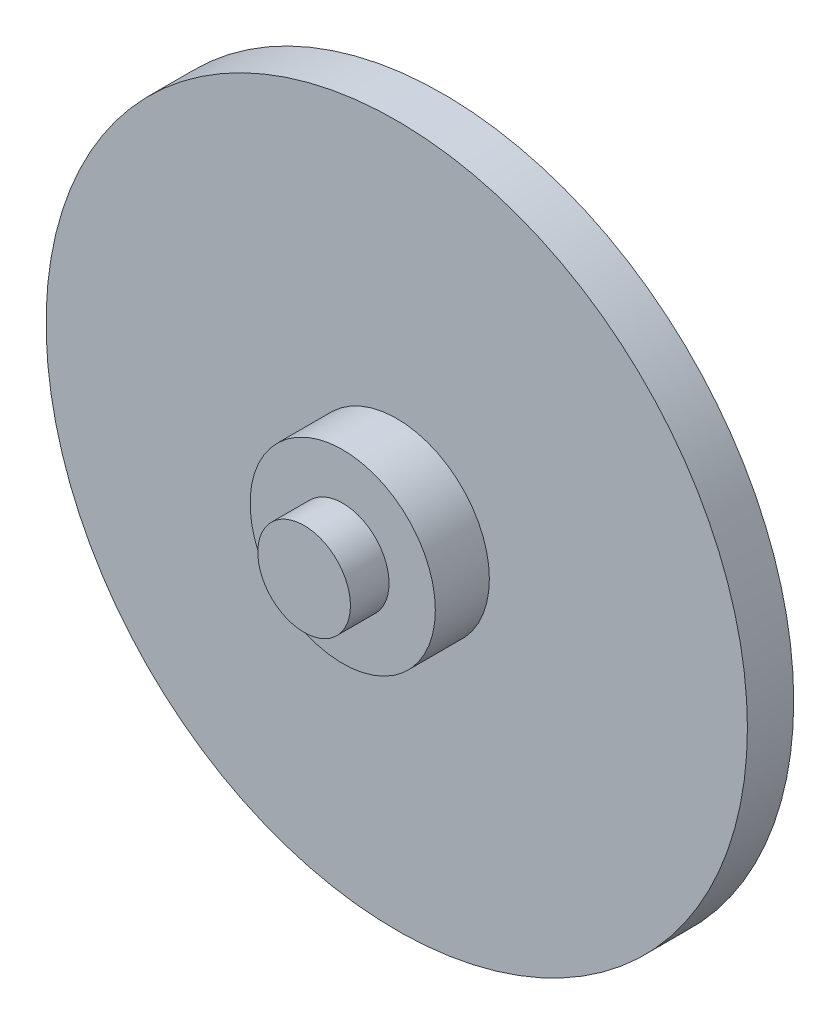
ISO-10303-21;
HEADER;
FILE_DESCRIPTION(('STEP AP214'),'2;1');
FILE_NAME('part.step','',(''),(''),'','','');
FILE_SCHEMA(('AUTOMOTIVE_DESIGN { 1 0 10303 214 1 1 1 1 }'));
ENDSEC;
DATA;
#1=APPLICATION_CONTEXT('core data for automotive mechanical design processes');
#2=APPLICATION_PROTOCOL_DEFINITION('international standard','automotive_design',2000,#1);
#3=PRODUCT_CONTEXT('',#1,'mechanical');
#4=PRODUCT('Part','Part','',(#3));
#5=PRODUCT_RELATED_PRODUCT_CATEGORY('part','',(#4));
#6=PRODUCT_DEFINITION_FORMATION('','',#4);
#7=PRODUCT_DEFINITION_CONTEXT('part definition',#1,'design');
#8=PRODUCT_DEFINITION('design','',#6,#7);
#9=PRODUCT_DEFINITION_SHAPE('','',#8);
#10=(LENGTH_UNIT() NAMED_UNIT(*) SI_UNIT(.MILLI.,.METRE.));
#11=(NAMED_UNIT(*) PLANE_ANGLE_UNIT() SI_UNIT($,.RADIAN.));
#12=(NAMED_UNIT(*) SI_UNIT($,.STERADIAN.) SOLID_ANGLE_UNIT());
#13=UNCERTAINTY_MEASURE_WITH_UNIT(LENGTH_MEASURE(1.E-05),#10,'distance_accuracy_value','');
#14=(GEOMETRIC_REPRESENTATION_CONTEXT(3) GLOBAL_UNCERTAINTY_ASSIGNED_CONTEXT((#13)) GLOBAL_UNIT_ASSIGNED_CONTEXT((#10,
#11,#12)) REPRESENTATION_CONTEXT('',''));
#15=CARTESIAN_POINT('',(0.,0.,0.));
#16=DIRECTION('',(0.,0.,1.));
#17=DIRECTION('',(1.,0.,0.));
#18=AXIS2_PLACEMENT_3D('',#15,#16,#17);
#19=CARTESIAN_POINT('',(-5.26595400064789,0.,3.98021116044797));
#20=DIRECTION('',(0.,0.,-1.));
#21=DIRECTION('',(-1.,0.,0.));
#22=AXIS2_PLACEMENT_3D('',#19,#20,#21);
#23=CYLINDRICAL_SURFACE('',#22,6.8145);
#24=CARTESIAN_POINT('',(-5.26595400064789,0.,3.98021116044797));
#25=DIRECTION('',(0.,0.,1.));
#26=DIRECTION('',(1.,0.,0.));
#27=AXIS2_PLACEMENT_3D('',#24,#25,#26);
#28=CIRCLE('',#27,6.8145);
#29=CARTESIAN_POINT('',(1.54854599935211,0.,3.98021116044797));
#30=VERTEX_POINT('',#29);
#31=EDGE_CURVE('E47',#30,#30,#28,.T.);
#32=ORIENTED_EDGE('',*,*,#31,.F.);
#33=EDGE_LOOP('',(#32));
#34=FACE_BOUND('',#33,.T.);
#35=CARTESIAN_POINT('',(-5.26595400064789,0.,3.08021116044797));
#36=DIRECTION('',(0.,0.,1.));
#37=DIRECTION('',(1.,0.,0.));
#38=AXIS2_PLACEMENT_3D('',#35,#36,#37);
#39=CIRCLE('',#38,6.8145);
#40=CARTESIAN_POINT('',(1.54854599935211,0.,3.08021116044797));
#41=VERTEX_POINT('',#40);
#42=EDGE_CURVE('E38',#41,#41,#39,.T.);
#43=ORIENTED_EDGE('',*,*,#42,.T.);
#44=EDGE_LOOP('',(#43));
#45=FACE_BOUND('',#44,.T.);
#46=ADVANCED_FACE('F35',(#34,#45),#23,.T.);
#47=CARTESIAN_POINT('',(-5.26595400064789,0.,3.98021116044797));
#48=DIRECTION('',(0.,0.,1.));
#49=DIRECTION('',(1.,0.,0.));
#50=AXIS2_PLACEMENT_3D('',#47,#48,#49);
#51=PLANE('',#50);
#52=CARTESIAN_POINT('',(-5.26595400064789,0.,3.98021116044797));
#53=DIRECTION('',(0.,0.,1.));
#54=DIRECTION('',(1.,0.,0.));
#55=AXIS2_PLACEMENT_3D('',#52,#53,#54);
#56=CIRCLE('',#55,1.8);
#57=CARTESIAN_POINT('',(-3.46595400064789,0.,3.98021116044797));
#58=VERTEX_POINT('',#57);
#59=EDGE_CURVE('E42',#58,#58,#56,.T.);
#60=ORIENTED_EDGE('',*,*,#59,.F.);
#61=EDGE_LOOP('',(#60));
#62=FACE_BOUND('',#61,.T.);
#63=ORIENTED_EDGE('',*,*,#31,.T.);
#64=EDGE_LOOP('',(#63));
#65=FACE_BOUND('',#64,.T.);
#66=ADVANCED_FACE('F65',(#62,#65),#51,.T.);
#67=CARTESIAN_POINT('',(-5.26595400064789,0.,3.08021116044797));
#68=DIRECTION('',(0.,0.,1.));
#69=DIRECTION('',(1.,0.,0.));
#70=AXIS2_PLACEMENT_3D('',#67,#68,#69);
#71=PLANE('',#70);
#72=CARTESIAN_POINT('',(-5.26595400064789,0.,3.08021116044797));
#73=DIRECTION('',(0.,0.,-1.));
#74=DIRECTION('',(-1.,0.,0.));
#75=AXIS2_PLACEMENT_3D('',#72,#73,#74);
#76=CIRCLE('',#75,0.45);
#77=CARTESIAN_POINT('',(-5.71595400064789,0.,3.08021116044797));
#78=VERTEX_POINT('',#77);
#79=EDGE_CURVE('E151',#78,#78,#76,.T.);
#80=ORIENTED_EDGE('',*,*,#79,.F.);
#81=EDGE_LOOP('',(#80));
#82=FACE_BOUND('',#81,.T.);
#83=ORIENTED_EDGE('',*,*,#42,.F.);
#84=EDGE_LOOP('',(#83));
#85=FACE_BOUND('',#84,.T.);
#86=ADVANCED_FACE('F62',(#82,#85),#71,.F.);
#87=CARTESIAN_POINT('',(-5.26595400064789,0.,5.03021116044797));
#88=DIRECTION('',(0.,0.,-1.));
#89=DIRECTION('',(-1.,0.,0.));
#90=AXIS2_PLACEMENT_3D('',#87,#88,#89);
#91=CYLINDRICAL_SURFACE('',#90,1.8);
#92=CARTESIAN_POINT('',(-5.26595400064789,0.,5.03021116044797));
#93=DIRECTION('',(0.,0.,1.));
#94=DIRECTION('',(1.,0.,0.));
#95=AXIS2_PLACEMENT_3D('',#92,#93,#94);
#96=CIRCLE('',#95,1.8);
#97=CARTESIAN_POINT('',(-3.46595400064789,0.,5.03021116044797));
#98=VERTEX_POINT('',#97);
#99=EDGE_CURVE('E53',#98,#98,#96,.T.);
#100=ORIENTED_EDGE('',*,*,#99,.F.);
#101=EDGE_LOOP('',(#100));
#102=FACE_BOUND('',#101,.T.);
#103=ORIENTED_EDGE('',*,*,#59,.T.);
#104=EDGE_LOOP('',(#103));
#105=FACE_BOUND('',#104,.T.);
#106=ADVANCED_FACE('F64',(#102,#105),#91,.T.);
#107=CARTESIAN_POINT('',(-5.26595400064789,0.,5.03021116044797));
#108=DIRECTION('',(0.,0.,1.));
#109=DIRECTION('',(1.,0.,0.));
#110=AXIS2_PLACEMENT_3D('',#107,#108,#109);
#111=PLANE('',#110);
#112=CARTESIAN_POINT('',(-5.26595400064789,0.,5.03021116044797));
#113=DIRECTION('',(0.,0.,1.));
#114=DIRECTION('',(1.,0.,0.));
#115=AXIS2_PLACEMENT_3D('',#112,#113,#114);
#116=CIRCLE('',#115,0.9);
#117=CARTESIAN_POINT('',(-4.36595400064789,0.,5.03021116044797));
#118=VERTEX_POINT('',#117);
#119=EDGE_CURVE('E10',#118,#118,#116,.T.);
#120=ORIENTED_EDGE('',*,*,#119,.F.);
#121=EDGE_LOOP('',(#120));
#122=FACE_BOUND('',#121,.T.);
#123=ORIENTED_EDGE('',*,*,#99,.T.);
#124=EDGE_LOOP('',(#123));
#125=FACE_BOUND('',#124,.T.);
#126=ADVANCED_FACE('F71',(#122,#125),#111,.T.);
#127=CARTESIAN_POINT('',(-5.26595400064789,0.,5.78021116044797));
#128=DIRECTION('',(0.,0.,-1.));
#129=DIRECTION('',(-1.,0.,0.));
#130=AXIS2_PLACEMENT_3D('',#127,#128,#129);
#131=CYLINDRICAL_SURFACE('',#130,0.9);
#132=CARTESIAN_POINT('',(-5.26595400064789,0.,5.78021116044797));
#133=DIRECTION('',(0.,0.,1.));
#134=DIRECTION('',(1.,0.,0.));
#135=AXIS2_PLACEMENT_3D('',#132,#133,#134);
#136=CIRCLE('',#135,0.9);
#137=CARTESIAN_POINT('',(-4.36595400064789,0.,5.78021116044797));
#138=VERTEX_POINT('',#137);
#139=EDGE_CURVE('E51',#138,#138,#136,.T.);
#140=ORIENTED_EDGE('',*,*,#139,.F.);
#141=EDGE_LOOP('',(#140));
#142=FACE_BOUND('',#141,.T.);
#143=ORIENTED_EDGE('',*,*,#119,.T.);
#144=EDGE_LOOP('',(#143));
#145=FACE_BOUND('',#144,.T.);
#146=ADVANCED_FACE('F104',(#142,#145),#131,.T.);
#147=CARTESIAN_POINT('',(-5.26595400064789,0.,5.78021116044797));
#148=DIRECTION('',(0.,0.,1.));
#149=DIRECTION('',(1.,0.,0.));
#150=AXIS2_PLACEMENT_3D('',#147,#148,#149);
#151=PLANE('',#150);
#152=ORIENTED_EDGE('',*,*,#139,.T.);
#153=EDGE_LOOP('',(#152));
#154=FACE_BOUND('',#153,.T.);
#155=ADVANCED_FACE('F114',(#154),#151,.T.);
#156=CARTESIAN_POINT('',(-5.26595400064789,0.,5.03021116044797));
#157=DIRECTION('',(0.,0.,-1.));
#158=DIRECTION('',(-1.,0.,0.));
#159=AXIS2_PLACEMENT_3D('',#156,#157,#158);
#160=CYLINDRICAL_SURFACE('',#159,0.45);
#161=CARTESIAN_POINT('',(-5.26595400064789,0.,5.03021116044797));
#162=DIRECTION('',(0.,0.,-1.));
#163=DIRECTION('',(-1.,0.,0.));
#164=AXIS2_PLACEMENT_3D('',#161,#162,#163);
#165=CIRCLE('',#164,0.45);
#166=CARTESIAN_POINT('',(-5.71595400064789,0.,5.03021116044797));
#167=VERTEX_POINT('',#166);
#168=EDGE_CURVE('E150',#167,#167,#165,.T.);
#169=ORIENTED_EDGE('',*,*,#168,.F.);
#170=EDGE_LOOP('',(#169));
#171=FACE_BOUND('',#170,.T.);
#172=ORIENTED_EDGE('',*,*,#79,.T.);
#173=EDGE_LOOP('',(#172));
#174=FACE_BOUND('',#173,.T.);
#175=ADVANCED_FACE('F124',(#171,#174),#160,.F.);
#176=CARTESIAN_POINT('',(-5.26595400064789,0.,5.03021116044797));
#177=DIRECTION('',(0.,0.,-1.));
#178=DIRECTION('',(-1.,0.,0.));
#179=AXIS2_PLACEMENT_3D('',#176,#177,#178);
#180=PLANE('',#179);
#181=ORIENTED_EDGE('',*,*,#168,.T.);
#182=EDGE_LOOP('',(#181));
#183=FACE_BOUND('',#182,.T.);
#184=ADVANCED_FACE('F134',(#183),#180,.T.);
#185=CLOSED_SHELL('',(#46,#66,#86,#106,#126,#146,#155,#175,#184));
#186=MANIFOLD_SOLID_BREP('B2',#185);
#187=ADVANCED_BREP_SHAPE_REPRESENTATION('',(#18,#186),#14);
#188=SHAPE_DEFINITION_REPRESENTATION(#9,#187);
ENDSEC;
END-ISO-10303-21;
